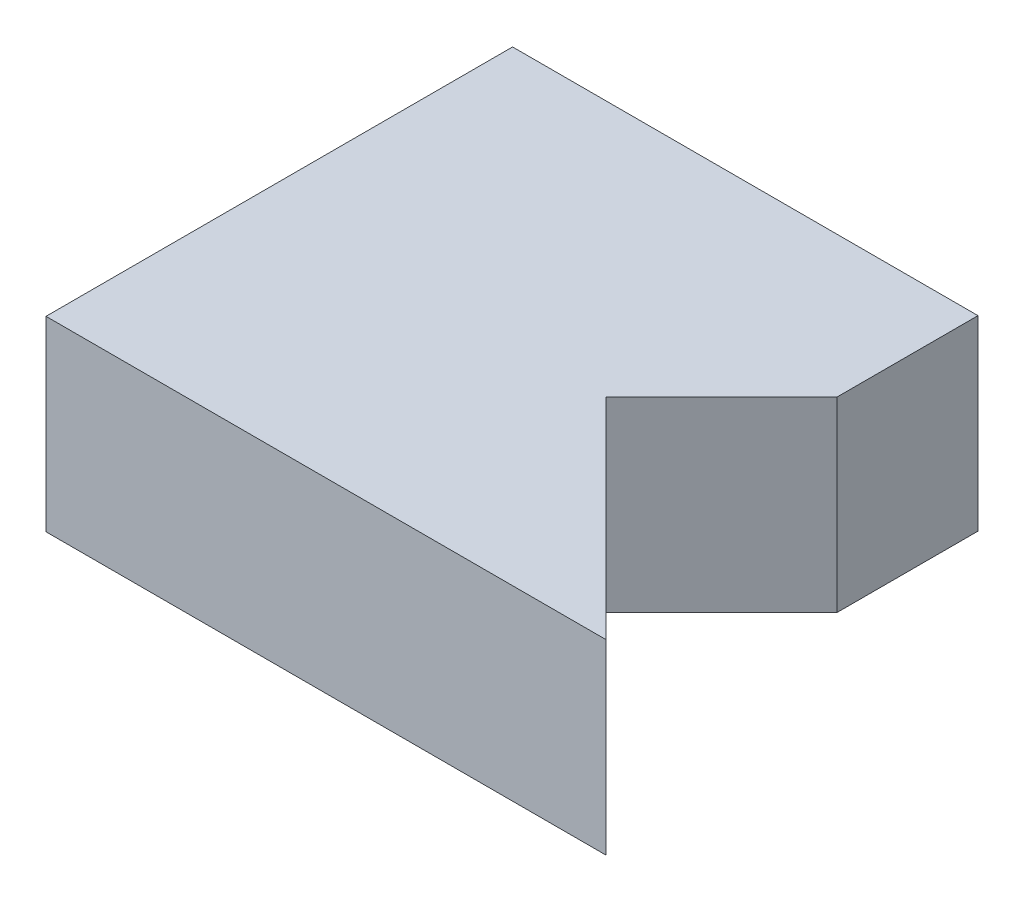
ISO-10303-21;
HEADER;
FILE_DESCRIPTION(('STEP AP214'),'2;1');
FILE_NAME('part.step','',(''),(''),'','','');
FILE_SCHEMA(('AUTOMOTIVE_DESIGN { 1 0 10303 214 1 1 1 1 }'));
ENDSEC;
DATA;
#1=APPLICATION_CONTEXT('core data for automotive mechanical design processes');
#2=APPLICATION_PROTOCOL_DEFINITION('international standard','automotive_design',2000,#1);
#3=PRODUCT_CONTEXT('',#1,'mechanical');
#4=PRODUCT('Part','Part','',(#3));
#5=PRODUCT_RELATED_PRODUCT_CATEGORY('part','',(#4));
#6=PRODUCT_DEFINITION_FORMATION('','',#4);
#7=PRODUCT_DEFINITION_CONTEXT('part definition',#1,'design');
#8=PRODUCT_DEFINITION('design','',#6,#7);
#9=PRODUCT_DEFINITION_SHAPE('','',#8);
#10=(LENGTH_UNIT() NAMED_UNIT(*) SI_UNIT(.MILLI.,.METRE.));
#11=(NAMED_UNIT(*) PLANE_ANGLE_UNIT() SI_UNIT($,.RADIAN.));
#12=(NAMED_UNIT(*) SI_UNIT($,.STERADIAN.) SOLID_ANGLE_UNIT());
#13=UNCERTAINTY_MEASURE_WITH_UNIT(LENGTH_MEASURE(1.E-05),#10,'distance_accuracy_value','');
#14=(GEOMETRIC_REPRESENTATION_CONTEXT(3) GLOBAL_UNCERTAINTY_ASSIGNED_CONTEXT((#13)) GLOBAL_UNIT_ASSIGNED_CONTEXT((#10,
#11,#12)) REPRESENTATION_CONTEXT('',''));
#15=CARTESIAN_POINT('',(0.,0.,0.));
#16=DIRECTION('',(0.,0.,1.));
#17=DIRECTION('',(1.,0.,0.));
#18=AXIS2_PLACEMENT_3D('',#15,#16,#17);
#19=CARTESIAN_POINT('',(0.,40.,-100.));
#20=DIRECTION('',(1.,0.,0.));
#21=DIRECTION('',(0.,0.,-1.));
#22=AXIS2_PLACEMENT_3D('',#19,#20,#21);
#23=PLANE('',#22);
#24=DIRECTION('',(0.,0.,1.));
#25=VECTOR('',#24,1.);
#26=CARTESIAN_POINT('',(0.,0.,-100.));
#27=LINE('',#26,#25);
#28=CARTESIAN_POINT('',(0.,0.,-100.));
#29=VERTEX_POINT('',#28);
#30=CARTESIAN_POINT('',(0.,0.,0.));
#31=VERTEX_POINT('',#30);
#32=EDGE_CURVE('E117',#29,#31,#27,.T.);
#33=ORIENTED_EDGE('',*,*,#32,.T.);
#34=DIRECTION('',(0.,-1.,0.));
#35=VECTOR('',#34,1.);
#36=CARTESIAN_POINT('',(0.,40.,0.));
#37=LINE('',#36,#35);
#38=CARTESIAN_POINT('',(0.,40.,0.));
#39=VERTEX_POINT('',#38);
#40=EDGE_CURVE('E11',#39,#31,#37,.T.);
#41=ORIENTED_EDGE('',*,*,#40,.F.);
#42=DIRECTION('',(0.,0.,1.));
#43=VECTOR('',#42,1.);
#44=CARTESIAN_POINT('',(0.,40.,-100.));
#45=LINE('',#44,#43);
#46=CARTESIAN_POINT('',(0.,40.,-100.));
#47=VERTEX_POINT('',#46);
#48=EDGE_CURVE('E127',#47,#39,#45,.T.);
#49=ORIENTED_EDGE('',*,*,#48,.F.);
#50=DIRECTION('',(0.,-1.,0.));
#51=VECTOR('',#50,1.);
#52=CARTESIAN_POINT('',(0.,40.,-100.));
#53=LINE('',#52,#51);
#54=EDGE_CURVE('E113',#47,#29,#53,.T.);
#55=ORIENTED_EDGE('',*,*,#54,.T.);
#56=EDGE_LOOP('',(#33,#41,#49,#55));
#57=FACE_BOUND('',#56,.T.);
#58=ADVANCED_FACE('F33',(#57),#23,.F.);
#59=CARTESIAN_POINT('',(0.,40.,0.));
#60=DIRECTION('',(0.,0.,-1.));
#61=DIRECTION('',(-1.,0.,0.));
#62=AXIS2_PLACEMENT_3D('',#59,#60,#61);
#63=PLANE('',#62);
#64=DIRECTION('',(1.,0.,0.));
#65=VECTOR('',#64,1.);
#66=CARTESIAN_POINT('',(0.,0.,0.));
#67=LINE('',#66,#65);
#68=CARTESIAN_POINT('',(120.,0.,0.));
#69=VERTEX_POINT('',#68);
#70=EDGE_CURVE('E120',#31,#69,#67,.T.);
#71=ORIENTED_EDGE('',*,*,#70,.T.);
#72=DIRECTION('',(0.,-1.,0.));
#73=VECTOR('',#72,1.);
#74=CARTESIAN_POINT('',(120.,40.,0.));
#75=LINE('',#74,#73);
#76=CARTESIAN_POINT('',(120.,40.,0.));
#77=VERTEX_POINT('',#76);
#78=EDGE_CURVE('E41',#77,#69,#75,.T.);
#79=ORIENTED_EDGE('',*,*,#78,.F.);
#80=DIRECTION('',(1.,0.,0.));
#81=VECTOR('',#80,1.);
#82=CARTESIAN_POINT('',(0.,40.,0.));
#83=LINE('',#82,#81);
#84=EDGE_CURVE('E86',#39,#77,#83,.T.);
#85=ORIENTED_EDGE('',*,*,#84,.F.);
#86=ORIENTED_EDGE('',*,*,#40,.T.);
#87=EDGE_LOOP('',(#71,#79,#85,#86));
#88=FACE_BOUND('',#87,.T.);
#89=ADVANCED_FACE('F151',(#88),#63,.F.);
#90=CARTESIAN_POINT('',(120.,40.,0.));
#91=DIRECTION('',(-0.707106781186543,0.,0.707106781186552));
#92=DIRECTION('',(0.707106781186552,0.,0.707106781186543));
#93=AXIS2_PLACEMENT_3D('',#90,#91,#92);
#94=PLANE('',#93);
#95=DIRECTION('',(-0.707106781186552,0.,-0.707106781186543));
#96=VECTOR('',#95,1.);
#97=CARTESIAN_POINT('',(120.,0.,0.));
#98=LINE('',#97,#96);
#99=CARTESIAN_POINT('',(75.,0.,-44.9999999999995));
#100=VERTEX_POINT('',#99);
#101=EDGE_CURVE('E122',#69,#100,#98,.T.);
#102=ORIENTED_EDGE('',*,*,#101,.T.);
#103=DIRECTION('',(0.,-1.,0.));
#104=VECTOR('',#103,1.);
#105=CARTESIAN_POINT('',(75.,40.,-44.9999999999995));
#106=LINE('',#105,#104);
#107=CARTESIAN_POINT('',(75.,40.,-44.9999999999995));
#108=VERTEX_POINT('',#107);
#109=EDGE_CURVE('E108',#108,#100,#106,.T.);
#110=ORIENTED_EDGE('',*,*,#109,.F.);
#111=DIRECTION('',(-0.707106781186552,0.,-0.707106781186543));
#112=VECTOR('',#111,1.);
#113=CARTESIAN_POINT('',(120.,40.,0.));
#114=LINE('',#113,#112);
#115=EDGE_CURVE('E99',#77,#108,#114,.T.);
#116=ORIENTED_EDGE('',*,*,#115,.F.);
#117=ORIENTED_EDGE('',*,*,#78,.T.);
#118=EDGE_LOOP('',(#102,#110,#116,#117));
#119=FACE_BOUND('',#118,.T.);
#120=ADVANCED_FACE('F133',(#119),#94,.F.);
#121=CARTESIAN_POINT('',(75.,40.,-44.9999999999995));
#122=DIRECTION('',(-0.707106781186551,0.,-0.707106781186544));
#123=DIRECTION('',(-0.707106781186544,0.,0.707106781186551));
#124=AXIS2_PLACEMENT_3D('',#121,#122,#123);
#125=PLANE('',#124);
#126=DIRECTION('',(0.707106781186544,0.,-0.707106781186551));
#127=VECTOR('',#126,1.);
#128=CARTESIAN_POINT('',(75.,0.,-44.9999999999995));
#129=LINE('',#128,#127);
#130=CARTESIAN_POINT('',(99.748737341529,0.,-69.7487373415288));
#131=VERTEX_POINT('',#130);
#132=EDGE_CURVE('E107',#100,#131,#129,.T.);
#133=ORIENTED_EDGE('',*,*,#132,.T.);
#134=DIRECTION('',(0.,-1.,0.));
#135=VECTOR('',#134,1.);
#136=CARTESIAN_POINT('',(99.748737341529,40.,-69.7487373415288));
#137=LINE('',#136,#135);
#138=CARTESIAN_POINT('',(99.748737341529,40.,-69.7487373415288));
#139=VERTEX_POINT('',#138);
#140=EDGE_CURVE('E104',#139,#131,#137,.T.);
#141=ORIENTED_EDGE('',*,*,#140,.F.);
#142=DIRECTION('',(0.707106781186544,0.,-0.707106781186551));
#143=VECTOR('',#142,1.);
#144=CARTESIAN_POINT('',(75.,40.,-44.9999999999995));
#145=LINE('',#144,#143);
#146=EDGE_CURVE('E93',#108,#139,#145,.T.);
#147=ORIENTED_EDGE('',*,*,#146,.F.);
#148=ORIENTED_EDGE('',*,*,#109,.T.);
#149=EDGE_LOOP('',(#133,#141,#147,#148));
#150=FACE_BOUND('',#149,.T.);
#151=ADVANCED_FACE('F105',(#150),#125,.F.);
#152=CARTESIAN_POINT('',(99.748737341529,40.,-69.7487373415288));
#153=DIRECTION('',(-1.,0.,0.));
#154=DIRECTION('',(0.,0.,1.));
#155=AXIS2_PLACEMENT_3D('',#152,#153,#154);
#156=PLANE('',#155);
#157=DIRECTION('',(0.,0.,-1.));
#158=VECTOR('',#157,1.);
#159=CARTESIAN_POINT('',(99.748737341529,0.,-69.7487373415288));
#160=LINE('',#159,#158);
#161=CARTESIAN_POINT('',(99.7487373415291,0.,-100.));
#162=VERTEX_POINT('',#161);
#163=EDGE_CURVE('E72',#131,#162,#160,.T.);
#164=ORIENTED_EDGE('',*,*,#163,.T.);
#165=DIRECTION('',(0.,-1.,0.));
#166=VECTOR('',#165,1.);
#167=CARTESIAN_POINT('',(99.7487373415291,40.,-100.));
#168=LINE('',#167,#166);
#169=CARTESIAN_POINT('',(99.7487373415291,40.,-100.));
#170=VERTEX_POINT('',#169);
#171=EDGE_CURVE('E109',#170,#162,#168,.T.);
#172=ORIENTED_EDGE('',*,*,#171,.F.);
#173=DIRECTION('',(0.,0.,-1.));
#174=VECTOR('',#173,1.);
#175=CARTESIAN_POINT('',(99.748737341529,40.,-69.7487373415288));
#176=LINE('',#175,#174);
#177=EDGE_CURVE('E97',#139,#170,#176,.T.);
#178=ORIENTED_EDGE('',*,*,#177,.F.);
#179=ORIENTED_EDGE('',*,*,#140,.T.);
#180=EDGE_LOOP('',(#164,#172,#178,#179));
#181=FACE_BOUND('',#180,.T.);
#182=ADVANCED_FACE('F111',(#181),#156,.F.);
#183=CARTESIAN_POINT('',(99.7487373415291,40.,-100.));
#184=DIRECTION('',(0.,0.,1.));
#185=DIRECTION('',(1.,0.,0.));
#186=AXIS2_PLACEMENT_3D('',#183,#184,#185);
#187=PLANE('',#186);
#188=DIRECTION('',(-1.,0.,0.));
#189=VECTOR('',#188,1.);
#190=CARTESIAN_POINT('',(99.7487373415291,0.,-100.));
#191=LINE('',#190,#189);
#192=EDGE_CURVE('E78',#162,#29,#191,.T.);
#193=ORIENTED_EDGE('',*,*,#192,.T.);
#194=ORIENTED_EDGE('',*,*,#54,.F.);
#195=DIRECTION('',(-1.,0.,0.));
#196=VECTOR('',#195,1.);
#197=CARTESIAN_POINT('',(99.7487373415291,40.,-100.));
#198=LINE('',#197,#196);
#199=EDGE_CURVE('E49',#170,#47,#198,.T.);
#200=ORIENTED_EDGE('',*,*,#199,.F.);
#201=ORIENTED_EDGE('',*,*,#171,.T.);
#202=EDGE_LOOP('',(#193,#194,#200,#201));
#203=FACE_BOUND('',#202,.T.);
#204=ADVANCED_FACE('F140',(#203),#187,.F.);
#205=CARTESIAN_POINT('',(0.,40.,0.));
#206=DIRECTION('',(0.,1.,0.));
#207=DIRECTION('',(0.,0.,1.));
#208=AXIS2_PLACEMENT_3D('',#205,#206,#207);
#209=PLANE('',#208);
#210=ORIENTED_EDGE('',*,*,#48,.T.);
#211=ORIENTED_EDGE('',*,*,#84,.T.);
#212=ORIENTED_EDGE('',*,*,#115,.T.);
#213=ORIENTED_EDGE('',*,*,#146,.T.);
#214=ORIENTED_EDGE('',*,*,#177,.T.);
#215=ORIENTED_EDGE('',*,*,#199,.T.);
#216=EDGE_LOOP('',(#210,#211,#212,#213,#214,#215));
#217=FACE_BOUND('',#216,.T.);
#218=ADVANCED_FACE('F95',(#217),#209,.T.);
#219=CARTESIAN_POINT('',(0.,0.,0.));
#220=DIRECTION('',(0.,1.,0.));
#221=DIRECTION('',(0.,0.,1.));
#222=AXIS2_PLACEMENT_3D('',#219,#220,#221);
#223=PLANE('',#222);
#224=ORIENTED_EDGE('',*,*,#32,.F.);
#225=ORIENTED_EDGE('',*,*,#192,.F.);
#226=ORIENTED_EDGE('',*,*,#163,.F.);
#227=ORIENTED_EDGE('',*,*,#132,.F.);
#228=ORIENTED_EDGE('',*,*,#101,.F.);
#229=ORIENTED_EDGE('',*,*,#70,.F.);
#230=EDGE_LOOP('',(#224,#225,#226,#227,#228,#229));
#231=FACE_BOUND('',#230,.T.);
#232=ADVANCED_FACE('F136',(#231),#223,.F.);
#233=CLOSED_SHELL('',(#58,#89,#120,#151,#182,#204,#218,#232));
#234=MANIFOLD_SOLID_BREP('B2',#233);
#235=ADVANCED_BREP_SHAPE_REPRESENTATION('',(#18,#234),#14);
#236=SHAPE_DEFINITION_REPRESENTATION(#9,#235);
ENDSEC;
END-ISO-10303-21;
